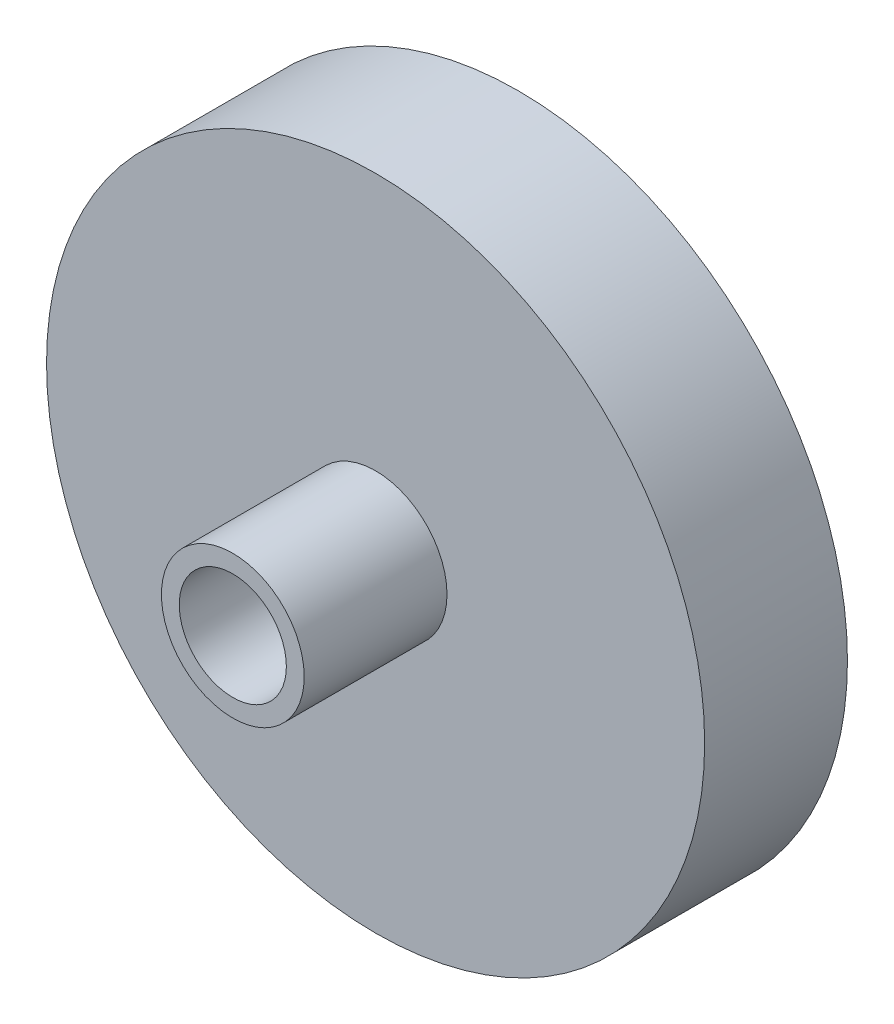
ISO-10303-21;
HEADER;
FILE_DESCRIPTION(('STEP AP214'),'2;1');
FILE_NAME('part.step','',(''),(''),'','','');
FILE_SCHEMA(('AUTOMOTIVE_DESIGN { 1 0 10303 214 1 1 1 1 }'));
ENDSEC;
DATA;
#1=APPLICATION_CONTEXT('core data for automotive mechanical design processes');
#2=APPLICATION_PROTOCOL_DEFINITION('international standard','automotive_design',2000,#1);
#3=PRODUCT_CONTEXT('',#1,'mechanical');
#4=PRODUCT('Part','Part','',(#3));
#5=PRODUCT_RELATED_PRODUCT_CATEGORY('part','',(#4));
#6=PRODUCT_DEFINITION_FORMATION('','',#4);
#7=PRODUCT_DEFINITION_CONTEXT('part definition',#1,'design');
#8=PRODUCT_DEFINITION('design','',#6,#7);
#9=PRODUCT_DEFINITION_SHAPE('','',#8);
#10=(LENGTH_UNIT() NAMED_UNIT(*) SI_UNIT(.MILLI.,.METRE.));
#11=(NAMED_UNIT(*) PLANE_ANGLE_UNIT() SI_UNIT($,.RADIAN.));
#12=(NAMED_UNIT(*) SI_UNIT($,.STERADIAN.) SOLID_ANGLE_UNIT());
#13=UNCERTAINTY_MEASURE_WITH_UNIT(LENGTH_MEASURE(1.E-05),#10,'distance_accuracy_value','');
#14=(GEOMETRIC_REPRESENTATION_CONTEXT(3) GLOBAL_UNCERTAINTY_ASSIGNED_CONTEXT((#13)) GLOBAL_UNIT_ASSIGNED_CONTEXT((#10,
#11,#12)) REPRESENTATION_CONTEXT('',''));
#15=CARTESIAN_POINT('',(0.,0.,0.));
#16=DIRECTION('',(0.,0.,1.));
#17=DIRECTION('',(1.,0.,0.));
#18=AXIS2_PLACEMENT_3D('',#15,#16,#17);
#19=CARTESIAN_POINT('',(0.,0.,20.));
#20=DIRECTION('',(0.,0.,-1.));
#21=DIRECTION('',(-1.,0.,0.));
#22=AXIS2_PLACEMENT_3D('',#19,#20,#21);
#23=CYLINDRICAL_SURFACE('',#22,46.0896453192133);
#24=CARTESIAN_POINT('',(0.,0.,20.));
#25=DIRECTION('',(0.,0.,1.));
#26=DIRECTION('',(1.,0.,0.));
#27=AXIS2_PLACEMENT_3D('',#24,#25,#26);
#28=CIRCLE('',#27,46.0896453192133);
#29=CARTESIAN_POINT('',(46.0896453192133,0.,20.));
#30=VERTEX_POINT('',#29);
#31=EDGE_CURVE('E45',#30,#30,#28,.T.);
#32=ORIENTED_EDGE('',*,*,#31,.F.);
#33=EDGE_LOOP('',(#32));
#34=FACE_BOUND('',#33,.T.);
#35=CARTESIAN_POINT('',(0.,0.,0.));
#36=DIRECTION('',(0.,0.,1.));
#37=DIRECTION('',(1.,0.,0.));
#38=AXIS2_PLACEMENT_3D('',#35,#36,#37);
#39=CIRCLE('',#38,46.0896453192133);
#40=CARTESIAN_POINT('',(46.0896453192133,0.,0.));
#41=VERTEX_POINT('',#40);
#42=EDGE_CURVE('E40',#41,#41,#39,.T.);
#43=ORIENTED_EDGE('',*,*,#42,.T.);
#44=EDGE_LOOP('',(#43));
#45=FACE_BOUND('',#44,.T.);
#46=ADVANCED_FACE('F37',(#34,#45),#23,.T.);
#47=CARTESIAN_POINT('',(0.,0.,20.));
#48=DIRECTION('',(0.,0.,1.));
#49=DIRECTION('',(1.,0.,0.));
#50=AXIS2_PLACEMENT_3D('',#47,#48,#49);
#51=PLANE('',#50);
#52=CARTESIAN_POINT('',(0.,0.,20.));
#53=DIRECTION('',(0.,0.,1.));
#54=DIRECTION('',(1.,0.,0.));
#55=AXIS2_PLACEMENT_3D('',#52,#53,#54);
#56=CIRCLE('',#55,10.);
#57=CARTESIAN_POINT('',(10.,0.,20.));
#58=VERTEX_POINT('',#57);
#59=EDGE_CURVE('E10',#58,#58,#56,.T.);
#60=ORIENTED_EDGE('',*,*,#59,.F.);
#61=EDGE_LOOP('',(#60));
#62=FACE_BOUND('',#61,.T.);
#63=ORIENTED_EDGE('',*,*,#31,.T.);
#64=EDGE_LOOP('',(#63));
#65=FACE_BOUND('',#64,.T.);
#66=ADVANCED_FACE('F86',(#62,#65),#51,.T.);
#67=CARTESIAN_POINT('',(0.,0.,0.));
#68=DIRECTION('',(0.,0.,1.));
#69=DIRECTION('',(1.,0.,0.));
#70=AXIS2_PLACEMENT_3D('',#67,#68,#69);
#71=PLANE('',#70);
#72=ORIENTED_EDGE('',*,*,#42,.F.);
#73=EDGE_LOOP('',(#72));
#74=FACE_BOUND('',#73,.T.);
#75=ADVANCED_FACE('F81',(#74),#71,.F.);
#76=CARTESIAN_POINT('',(0.,0.,40.));
#77=DIRECTION('',(0.,0.,-1.));
#78=DIRECTION('',(-1.,0.,0.));
#79=AXIS2_PLACEMENT_3D('',#76,#77,#78);
#80=CYLINDRICAL_SURFACE('',#79,10.);
#81=CARTESIAN_POINT('',(0.,0.,40.));
#82=DIRECTION('',(0.,0.,1.));
#83=DIRECTION('',(1.,0.,0.));
#84=AXIS2_PLACEMENT_3D('',#81,#82,#83);
#85=CIRCLE('',#84,10.);
#86=CARTESIAN_POINT('',(10.,0.,40.));
#87=VERTEX_POINT('',#86);
#88=EDGE_CURVE('E52',#87,#87,#85,.T.);
#89=ORIENTED_EDGE('',*,*,#88,.F.);
#90=EDGE_LOOP('',(#89));
#91=FACE_BOUND('',#90,.T.);
#92=ORIENTED_EDGE('',*,*,#59,.T.);
#93=EDGE_LOOP('',(#92));
#94=FACE_BOUND('',#93,.T.);
#95=ADVANCED_FACE('F76',(#91,#94),#80,.T.);
#96=CARTESIAN_POINT('',(0.,0.,40.));
#97=DIRECTION('',(0.,0.,1.));
#98=DIRECTION('',(1.,0.,0.));
#99=AXIS2_PLACEMENT_3D('',#96,#97,#98);
#100=PLANE('',#99);
#101=CARTESIAN_POINT('',(0.,0.,40.));
#102=DIRECTION('',(0.,0.,1.));
#103=DIRECTION('',(1.,0.,0.));
#104=AXIS2_PLACEMENT_3D('',#101,#102,#103);
#105=CIRCLE('',#104,7.5);
#106=CARTESIAN_POINT('',(7.5,0.,40.));
#107=VERTEX_POINT('',#106);
#108=EDGE_CURVE('E57',#107,#107,#105,.T.);
#109=ORIENTED_EDGE('',*,*,#108,.F.);
#110=EDGE_LOOP('',(#109));
#111=FACE_BOUND('',#110,.T.);
#112=ORIENTED_EDGE('',*,*,#88,.T.);
#113=EDGE_LOOP('',(#112));
#114=FACE_BOUND('',#113,.T.);
#115=ADVANCED_FACE('F70',(#111,#114),#100,.T.);
#116=CARTESIAN_POINT('',(0.,0.,20.));
#117=DIRECTION('',(0.,0.,1.));
#118=DIRECTION('',(1.,0.,0.));
#119=AXIS2_PLACEMENT_3D('',#116,#117,#118);
#120=CYLINDRICAL_SURFACE('',#119,7.5);
#121=CARTESIAN_POINT('',(0.,0.,20.));
#122=DIRECTION('',(0.,0.,1.));
#123=DIRECTION('',(1.,0.,0.));
#124=AXIS2_PLACEMENT_3D('',#121,#122,#123);
#125=CIRCLE('',#124,7.5);
#126=CARTESIAN_POINT('',(7.5,0.,20.));
#127=VERTEX_POINT('',#126);
#128=EDGE_CURVE('E56',#127,#127,#125,.T.);
#129=ORIENTED_EDGE('',*,*,#128,.F.);
#130=EDGE_LOOP('',(#129));
#131=FACE_BOUND('',#130,.T.);
#132=ORIENTED_EDGE('',*,*,#108,.T.);
#133=EDGE_LOOP('',(#132));
#134=FACE_BOUND('',#133,.T.);
#135=ADVANCED_FACE('F67',(#131,#134),#120,.F.);
#136=CARTESIAN_POINT('',(0.,0.,20.));
#137=DIRECTION('',(0.,0.,1.));
#138=DIRECTION('',(1.,0.,0.));
#139=AXIS2_PLACEMENT_3D('',#136,#137,#138);
#140=PLANE('',#139);
#141=ORIENTED_EDGE('',*,*,#128,.T.);
#142=EDGE_LOOP('',(#141));
#143=FACE_BOUND('',#142,.T.);
#144=ADVANCED_FACE('F65',(#143),#140,.T.);
#145=CLOSED_SHELL('',(#46,#66,#75,#95,#115,#135,#144));
#146=MANIFOLD_SOLID_BREP('B2',#145);
#147=ADVANCED_BREP_SHAPE_REPRESENTATION('',(#18,#146),#14);
#148=SHAPE_DEFINITION_REPRESENTATION(#9,#147);
ENDSEC;
END-ISO-10303-21;
